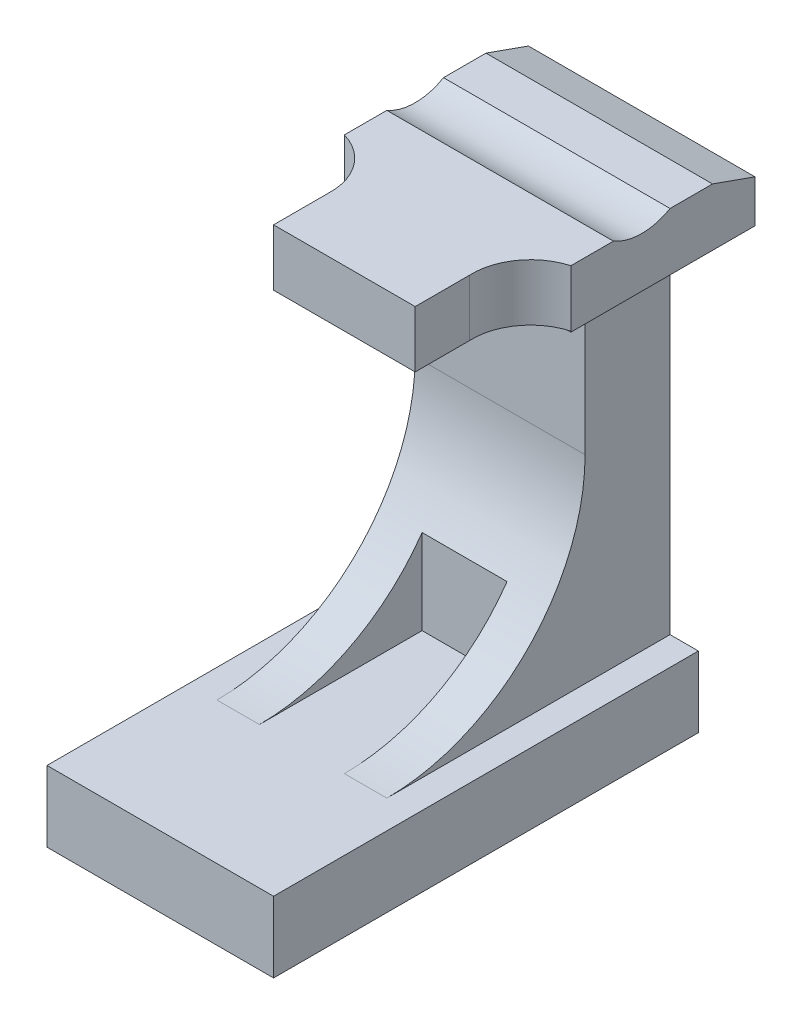
ISO-10303-21;
HEADER;
FILE_DESCRIPTION(('STEP AP214'),'2;1');
FILE_NAME('part.step','',(''),(''),'','','');
FILE_SCHEMA(('AUTOMOTIVE_DESIGN { 1 0 10303 214 1 1 1 1 }'));
ENDSEC;
DATA;
#1=APPLICATION_CONTEXT('core data for automotive mechanical design processes');
#2=APPLICATION_PROTOCOL_DEFINITION('international standard','automotive_design',2000,#1);
#3=PRODUCT_CONTEXT('',#1,'mechanical');
#4=PRODUCT('Part','Part','',(#3));
#5=PRODUCT_RELATED_PRODUCT_CATEGORY('part','',(#4));
#6=PRODUCT_DEFINITION_FORMATION('','',#4);
#7=PRODUCT_DEFINITION_CONTEXT('part definition',#1,'design');
#8=PRODUCT_DEFINITION('design','',#6,#7);
#9=PRODUCT_DEFINITION_SHAPE('','',#8);
#10=(LENGTH_UNIT() NAMED_UNIT(*) SI_UNIT(.MILLI.,.METRE.));
#11=(NAMED_UNIT(*) PLANE_ANGLE_UNIT() SI_UNIT($,.RADIAN.));
#12=(NAMED_UNIT(*) SI_UNIT($,.STERADIAN.) SOLID_ANGLE_UNIT());
#13=UNCERTAINTY_MEASURE_WITH_UNIT(LENGTH_MEASURE(1.E-05),#10,'distance_accuracy_value','');
#14=(GEOMETRIC_REPRESENTATION_CONTEXT(3) GLOBAL_UNCERTAINTY_ASSIGNED_CONTEXT((#13)) GLOBAL_UNIT_ASSIGNED_CONTEXT((#10,
#11,#12)) REPRESENTATION_CONTEXT('',''));
#15=CARTESIAN_POINT('',(0.,0.,0.));
#16=DIRECTION('',(0.,0.,1.));
#17=DIRECTION('',(1.,0.,0.));
#18=AXIS2_PLACEMENT_3D('',#15,#16,#17);
#19=CARTESIAN_POINT('',(-22.156862745098,145.,-105.));
#20=DIRECTION('',(0.,0.,1.));
#21=DIRECTION('',(1.,0.,0.));
#22=AXIS2_PLACEMENT_3D('',#19,#20,#21);
#23=PLANE('',#22);
#24=DIRECTION('',(0.,-1.,0.));
#25=VECTOR('',#24,1.);
#26=CARTESIAN_POINT('',(47.843137254902,145.,-105.));
#27=LINE('',#26,#25);
#28=CARTESIAN_POINT('',(47.843137254902,145.320204543823,-105.));
#29=VERTEX_POINT('',#28);
#30=CARTESIAN_POINT('',(47.843137254902,145.,-105.));
#31=VERTEX_POINT('',#30);
#32=EDGE_CURVE('E291',#29,#31,#27,.T.);
#33=ORIENTED_EDGE('',*,*,#32,.F.);
#34=DIRECTION('',(-1.,0.,0.));
#35=VECTOR('',#34,1.);
#36=CARTESIAN_POINT('',(-32.156862745098,145.320204543823,-105.));
#37=LINE('',#36,#35);
#38=CARTESIAN_POINT('',(-32.156862745098,145.320204543823,-105.));
#39=VERTEX_POINT('',#38);
#40=EDGE_CURVE('E213',#29,#39,#37,.T.);
#41=ORIENTED_EDGE('',*,*,#40,.T.);
#42=DIRECTION('',(0.,1.,0.));
#43=VECTOR('',#42,1.);
#44=CARTESIAN_POINT('',(-32.156862745098,165.320204543823,-105.));
#45=LINE('',#44,#43);
#46=CARTESIAN_POINT('',(-32.156862745098,145.,-105.));
#47=VERTEX_POINT('',#46);
#48=EDGE_CURVE('E253',#47,#39,#45,.T.);
#49=ORIENTED_EDGE('',*,*,#48,.F.);
#50=DIRECTION('',(1.,0.,0.));
#51=VECTOR('',#50,1.);
#52=CARTESIAN_POINT('',(-22.156862745098,145.,-105.));
#53=LINE('',#52,#51);
#54=EDGE_CURVE('E298',#47,#31,#53,.T.);
#55=ORIENTED_EDGE('',*,*,#54,.T.);
#56=EDGE_LOOP('',(#33,#41,#49,#55));
#57=FACE_BOUND('',#56,.T.);
#58=ADVANCED_FACE('F39',(#57),#23,.T.);
#59=CARTESIAN_POINT('',(-22.156862745098,0.,0.));
#60=DIRECTION('',(1.,0.,0.));
#61=DIRECTION('',(0.,1.,0.));
#62=AXIS2_PLACEMENT_3D('',#59,#60,#61);
#63=PLANE('',#62);
#64=DIRECTION('',(0.,0.,1.));
#65=VECTOR('',#64,1.);
#66=CARTESIAN_POINT('',(-22.156862745098,145.,-105.));
#67=LINE('',#66,#65);
#68=CARTESIAN_POINT('',(-22.156862745098,145.,-150.));
#69=VERTEX_POINT('',#68);
#70=CARTESIAN_POINT('',(-22.156862745098,145.,-120.));
#71=VERTEX_POINT('',#70);
#72=EDGE_CURVE('E247',#69,#71,#67,.T.);
#73=ORIENTED_EDGE('',*,*,#72,.F.);
#74=DIRECTION('',(0.,1.,0.));
#75=VECTOR('',#74,1.);
#76=CARTESIAN_POINT('',(-22.156862745098,0.,-150.));
#77=LINE('',#76,#75);
#78=CARTESIAN_POINT('',(-22.156862745098,25.,-150.));
#79=VERTEX_POINT('',#78);
#80=EDGE_CURVE('E341',#79,#69,#77,.T.);
#81=ORIENTED_EDGE('',*,*,#80,.F.);
#82=DIRECTION('',(0.,0.,1.));
#83=VECTOR('',#82,1.);
#84=CARTESIAN_POINT('',(-22.156862745098,25.,0.));
#85=LINE('',#84,#83);
#86=CARTESIAN_POINT('',(-22.156862745098,25.,-50.));
#87=VERTEX_POINT('',#86);
#88=EDGE_CURVE('E338',#79,#87,#85,.T.);
#89=ORIENTED_EDGE('',*,*,#88,.T.);
#90=CARTESIAN_POINT('',(-22.156862745098,95.,-50.));
#91=DIRECTION('',(1.,0.,0.));
#92=DIRECTION('',(0.,1.,0.));
#93=AXIS2_PLACEMENT_3D('',#90,#91,#92);
#94=CIRCLE('',#93,70.);
#95=CARTESIAN_POINT('',(-22.156862745098,95.,-120.));
#96=VERTEX_POINT('',#95);
#97=EDGE_CURVE('E335',#87,#96,#94,.T.);
#98=ORIENTED_EDGE('',*,*,#97,.T.);
#99=DIRECTION('',(0.,-1.,0.));
#100=VECTOR('',#99,1.);
#101=CARTESIAN_POINT('',(-22.156862745098,0.,-120.));
#102=LINE('',#101,#100);
#103=EDGE_CURVE('E332',#71,#96,#102,.T.);
#104=ORIENTED_EDGE('',*,*,#103,.F.);
#105=EDGE_LOOP('',(#73,#81,#89,#98,#104));
#106=FACE_BOUND('',#105,.T.);
#107=ADVANCED_FACE('F430',(#106),#63,.F.);
#108=CARTESIAN_POINT('',(37.843137254902,0.,0.));
#109=DIRECTION('',(1.,0.,0.));
#110=DIRECTION('',(0.,1.,0.));
#111=AXIS2_PLACEMENT_3D('',#108,#109,#110);
#112=PLANE('',#111);
#113=DIRECTION('',(0.,1.,0.));
#114=VECTOR('',#113,1.);
#115=CARTESIAN_POINT('',(37.843137254902,0.,-150.));
#116=LINE('',#115,#114);
#117=CARTESIAN_POINT('',(37.843137254902,25.,-150.));
#118=VERTEX_POINT('',#117);
#119=CARTESIAN_POINT('',(37.843137254902,145.,-150.));
#120=VERTEX_POINT('',#119);
#121=EDGE_CURVE('E336',#118,#120,#116,.T.);
#122=ORIENTED_EDGE('',*,*,#121,.T.);
#123=DIRECTION('',(0.,0.,-1.));
#124=VECTOR('',#123,1.);
#125=CARTESIAN_POINT('',(37.843137254902,145.,-170.));
#126=LINE('',#125,#124);
#127=CARTESIAN_POINT('',(37.843137254902,145.,-120.));
#128=VERTEX_POINT('',#127);
#129=EDGE_CURVE('E274',#128,#120,#126,.T.);
#130=ORIENTED_EDGE('',*,*,#129,.F.);
#131=DIRECTION('',(0.,-1.,0.));
#132=VECTOR('',#131,1.);
#133=CARTESIAN_POINT('',(37.843137254902,0.,-120.));
#134=LINE('',#133,#132);
#135=CARTESIAN_POINT('',(37.843137254902,95.,-120.));
#136=VERTEX_POINT('',#135);
#137=EDGE_CURVE('E330',#128,#136,#134,.T.);
#138=ORIENTED_EDGE('',*,*,#137,.T.);
#139=CARTESIAN_POINT('',(37.843137254902,95.,-50.));
#140=DIRECTION('',(1.,0.,0.));
#141=DIRECTION('',(0.,1.,0.));
#142=AXIS2_PLACEMENT_3D('',#139,#140,#141);
#143=CIRCLE('',#142,70.);
#144=CARTESIAN_POINT('',(37.843137254902,25.,-50.));
#145=VERTEX_POINT('',#144);
#146=EDGE_CURVE('E347',#145,#136,#143,.T.);
#147=ORIENTED_EDGE('',*,*,#146,.F.);
#148=DIRECTION('',(0.,0.,1.));
#149=VECTOR('',#148,1.);
#150=CARTESIAN_POINT('',(37.843137254902,25.,0.));
#151=LINE('',#150,#149);
#152=EDGE_CURVE('E350',#118,#145,#151,.T.);
#153=ORIENTED_EDGE('',*,*,#152,.F.);
#154=EDGE_LOOP('',(#122,#130,#138,#147,#153));
#155=FACE_BOUND('',#154,.T.);
#156=ADVANCED_FACE('F414',(#155),#112,.T.);
#157=CARTESIAN_POINT('',(-22.156862745098,95.,-50.));
#158=DIRECTION('',(1.,0.,0.));
#159=DIRECTION('',(0.,1.,0.));
#160=AXIS2_PLACEMENT_3D('',#157,#158,#159);
#161=CYLINDRICAL_SURFACE('',#160,70.);
#162=CARTESIAN_POINT('',(-7.15686274509801,95.,-50.));
#163=DIRECTION('',(1.,0.,0.));
#164=DIRECTION('',(0.,1.,0.));
#165=AXIS2_PLACEMENT_3D('',#162,#163,#164);
#166=CIRCLE('',#165,70.);
#167=CARTESIAN_POINT('',(-7.15686274509802,25.,-50.));
#168=VERTEX_POINT('',#167);
#169=CARTESIAN_POINT('',(-7.15686274509802,55.,-107.44562646538));
#170=VERTEX_POINT('',#169);
#171=EDGE_CURVE('E314',#168,#170,#166,.T.);
#172=ORIENTED_EDGE('',*,*,#171,.T.);
#173=DIRECTION('',(1.,0.,0.));
#174=VECTOR('',#173,1.);
#175=CARTESIAN_POINT('',(-7.15686274509802,55.,-107.44562646538));
#176=LINE('',#175,#174);
#177=CARTESIAN_POINT('',(22.843137254902,55.,-107.44562646538));
#178=VERTEX_POINT('',#177);
#179=EDGE_CURVE('E327',#170,#178,#176,.T.);
#180=ORIENTED_EDGE('',*,*,#179,.T.);
#181=CARTESIAN_POINT('',(22.843137254902,95.,-50.));
#182=DIRECTION('',(1.,0.,0.));
#183=DIRECTION('',(0.,1.,0.));
#184=AXIS2_PLACEMENT_3D('',#181,#182,#183);
#185=CIRCLE('',#184,70.);
#186=CARTESIAN_POINT('',(22.843137254902,25.,-50.));
#187=VERTEX_POINT('',#186);
#188=EDGE_CURVE('E303',#187,#178,#185,.T.);
#189=ORIENTED_EDGE('',*,*,#188,.F.);
#190=DIRECTION('',(1.,0.,0.));
#191=VECTOR('',#190,1.);
#192=CARTESIAN_POINT('',(-22.156862745098,25.,-50.));
#193=LINE('',#192,#191);
#194=EDGE_CURVE('E361',#187,#145,#193,.T.);
#195=ORIENTED_EDGE('',*,*,#194,.T.);
#196=ORIENTED_EDGE('',*,*,#146,.T.);
#197=DIRECTION('',(1.,0.,0.));
#198=VECTOR('',#197,1.);
#199=CARTESIAN_POINT('',(-22.156862745098,95.,-120.));
#200=LINE('',#199,#198);
#201=EDGE_CURVE('E362',#96,#136,#200,.T.);
#202=ORIENTED_EDGE('',*,*,#201,.F.);
#203=ORIENTED_EDGE('',*,*,#97,.F.);
#204=EDGE_CURVE('E358',#87,#168,#193,.T.);
#205=ORIENTED_EDGE('',*,*,#204,.T.);
#206=EDGE_LOOP('',(#172,#180,#189,#195,#196,#202,#203,#205));
#207=FACE_BOUND('',#206,.T.);
#208=ADVANCED_FACE('F419',(#207),#161,.F.);
#209=CARTESIAN_POINT('',(-32.156862745098,25.,-150.));
#210=DIRECTION('',(0.,1.,0.));
#211=DIRECTION('',(0.,0.,1.));
#212=AXIS2_PLACEMENT_3D('',#209,#210,#211);
#213=PLANE('',#212);
#214=ORIENTED_EDGE('',*,*,#204,.F.);
#215=ORIENTED_EDGE('',*,*,#88,.F.);
#216=DIRECTION('',(-1.,0.,0.));
#217=VECTOR('',#216,1.);
#218=CARTESIAN_POINT('',(-32.156862745098,25.,-150.));
#219=LINE('',#218,#217);
#220=CARTESIAN_POINT('',(-32.156862745098,25.,-150.));
#221=VERTEX_POINT('',#220);
#222=EDGE_CURVE('E372',#79,#221,#219,.T.);
#223=ORIENTED_EDGE('',*,*,#222,.T.);
#224=DIRECTION('',(0.,0.,1.));
#225=VECTOR('',#224,1.);
#226=CARTESIAN_POINT('',(-32.156862745098,25.,-150.));
#227=LINE('',#226,#225);
#228=CARTESIAN_POINT('',(-32.156862745098,25.,0.));
#229=VERTEX_POINT('',#228);
#230=EDGE_CURVE('E48',#221,#229,#227,.T.);
#231=ORIENTED_EDGE('',*,*,#230,.T.);
#232=DIRECTION('',(-1.,0.,0.));
#233=VECTOR('',#232,1.);
#234=CARTESIAN_POINT('',(-32.156862745098,25.,0.));
#235=LINE('',#234,#233);
#236=CARTESIAN_POINT('',(47.843137254902,25.,0.));
#237=VERTEX_POINT('',#236);
#238=EDGE_CURVE('E383',#237,#229,#235,.T.);
#239=ORIENTED_EDGE('',*,*,#238,.F.);
#240=DIRECTION('',(0.,0.,1.));
#241=VECTOR('',#240,1.);
#242=CARTESIAN_POINT('',(47.843137254902,25.,-150.));
#243=LINE('',#242,#241);
#244=CARTESIAN_POINT('',(47.843137254902,25.,-150.));
#245=VERTEX_POINT('',#244);
#246=EDGE_CURVE('E388',#245,#237,#243,.T.);
#247=ORIENTED_EDGE('',*,*,#246,.F.);
#248=EDGE_CURVE('E373',#245,#118,#219,.T.);
#249=ORIENTED_EDGE('',*,*,#248,.T.);
#250=ORIENTED_EDGE('',*,*,#152,.T.);
#251=ORIENTED_EDGE('',*,*,#194,.F.);
#252=DIRECTION('',(0.,0.,-1.));
#253=VECTOR('',#252,1.);
#254=CARTESIAN_POINT('',(22.843137254902,25.,0.));
#255=LINE('',#254,#253);
#256=CARTESIAN_POINT('',(22.843137254902,25.,-107.44562646538));
#257=VERTEX_POINT('',#256);
#258=EDGE_CURVE('E64',#187,#257,#255,.T.);
#259=ORIENTED_EDGE('',*,*,#258,.T.);
#260=DIRECTION('',(1.,0.,0.));
#261=VECTOR('',#260,1.);
#262=CARTESIAN_POINT('',(-7.15686274509802,25.,-107.44562646538));
#263=LINE('',#262,#261);
#264=CARTESIAN_POINT('',(-7.15686274509802,25.,-107.44562646538));
#265=VERTEX_POINT('',#264);
#266=EDGE_CURVE('E323',#265,#257,#263,.T.);
#267=ORIENTED_EDGE('',*,*,#266,.F.);
#268=DIRECTION('',(0.,0.,-1.));
#269=VECTOR('',#268,1.);
#270=CARTESIAN_POINT('',(-7.15686274509802,25.,0.));
#271=LINE('',#270,#269);
#272=EDGE_CURVE('E317',#168,#265,#271,.T.);
#273=ORIENTED_EDGE('',*,*,#272,.F.);
#274=EDGE_LOOP('',(#214,#215,#223,#231,#239,#247,#249,#250,#251,#259,#267,#273));
#275=FACE_BOUND('',#274,.T.);
#276=ADVANCED_FACE('F410',(#275),#213,.T.);
#277=CARTESIAN_POINT('',(47.843137254902,0.,-150.));
#278=DIRECTION('',(0.,-1.,0.));
#279=DIRECTION('',(0.,0.,-1.));
#280=AXIS2_PLACEMENT_3D('',#277,#278,#279);
#281=PLANE('',#280);
#282=DIRECTION('',(1.,0.,0.));
#283=VECTOR('',#282,1.);
#284=CARTESIAN_POINT('',(47.843137254902,0.,0.));
#285=LINE('',#284,#283);
#286=CARTESIAN_POINT('',(-32.156862745098,0.,0.));
#287=VERTEX_POINT('',#286);
#288=CARTESIAN_POINT('',(47.843137254902,0.,0.));
#289=VERTEX_POINT('',#288);
#290=EDGE_CURVE('E357',#287,#289,#285,.T.);
#291=ORIENTED_EDGE('',*,*,#290,.F.);
#292=DIRECTION('',(0.,0.,1.));
#293=VECTOR('',#292,1.);
#294=CARTESIAN_POINT('',(-32.156862745098,0.,-150.));
#295=LINE('',#294,#293);
#296=CARTESIAN_POINT('',(-32.156862745098,0.,-150.));
#297=VERTEX_POINT('',#296);
#298=EDGE_CURVE('E11',#297,#287,#295,.T.);
#299=ORIENTED_EDGE('',*,*,#298,.F.);
#300=DIRECTION('',(1.,0.,0.));
#301=VECTOR('',#300,1.);
#302=CARTESIAN_POINT('',(47.843137254902,0.,-150.));
#303=LINE('',#302,#301);
#304=CARTESIAN_POINT('',(47.843137254902,0.,-150.));
#305=VERTEX_POINT('',#304);
#306=EDGE_CURVE('E365',#297,#305,#303,.T.);
#307=ORIENTED_EDGE('',*,*,#306,.T.);
#308=DIRECTION('',(0.,0.,1.));
#309=VECTOR('',#308,1.);
#310=CARTESIAN_POINT('',(47.843137254902,0.,-150.));
#311=LINE('',#310,#309);
#312=EDGE_CURVE('E43',#305,#289,#311,.T.);
#313=ORIENTED_EDGE('',*,*,#312,.T.);
#314=EDGE_LOOP('',(#291,#299,#307,#313));
#315=FACE_BOUND('',#314,.T.);
#316=ADVANCED_FACE('F41',(#315),#281,.T.);
#317=CARTESIAN_POINT('',(-32.156862745098,0.,-150.));
#318=DIRECTION('',(-1.,0.,0.));
#319=DIRECTION('',(0.,-1.,0.));
#320=AXIS2_PLACEMENT_3D('',#317,#318,#319);
#321=PLANE('',#320);
#322=DIRECTION('',(0.,-1.,0.));
#323=VECTOR('',#322,1.);
#324=CARTESIAN_POINT('',(-32.156862745098,0.,0.));
#325=LINE('',#324,#323);
#326=EDGE_CURVE('E369',#229,#287,#325,.T.);
#327=ORIENTED_EDGE('',*,*,#326,.F.);
#328=ORIENTED_EDGE('',*,*,#230,.F.);
#329=DIRECTION('',(0.,-1.,0.));
#330=VECTOR('',#329,1.);
#331=CARTESIAN_POINT('',(-32.156862745098,0.,-150.));
#332=LINE('',#331,#330);
#333=EDGE_CURVE('E375',#221,#297,#332,.T.);
#334=ORIENTED_EDGE('',*,*,#333,.T.);
#335=ORIENTED_EDGE('',*,*,#298,.T.);
#336=EDGE_LOOP('',(#327,#328,#334,#335));
#337=FACE_BOUND('',#336,.T.);
#338=ADVANCED_FACE('F402',(#337),#321,.T.);
#339=CARTESIAN_POINT('',(47.843137254902,25.,-150.));
#340=DIRECTION('',(1.,0.,0.));
#341=DIRECTION('',(0.,1.,0.));
#342=AXIS2_PLACEMENT_3D('',#339,#340,#341);
#343=PLANE('',#342);
#344=DIRECTION('',(0.,1.,0.));
#345=VECTOR('',#344,1.);
#346=CARTESIAN_POINT('',(47.843137254902,25.,0.));
#347=LINE('',#346,#345);
#348=EDGE_CURVE('E380',#289,#237,#347,.T.);
#349=ORIENTED_EDGE('',*,*,#348,.F.);
#350=ORIENTED_EDGE('',*,*,#312,.F.);
#351=DIRECTION('',(0.,1.,0.));
#352=VECTOR('',#351,1.);
#353=CARTESIAN_POINT('',(47.843137254902,25.,-150.));
#354=LINE('',#353,#352);
#355=EDGE_CURVE('E368',#305,#245,#354,.T.);
#356=ORIENTED_EDGE('',*,*,#355,.T.);
#357=ORIENTED_EDGE('',*,*,#246,.T.);
#358=EDGE_LOOP('',(#349,#350,#356,#357));
#359=FACE_BOUND('',#358,.T.);
#360=ADVANCED_FACE('F396',(#359),#343,.T.);
#361=CARTESIAN_POINT('',(0.,0.,-150.));
#362=DIRECTION('',(0.,0.,-1.));
#363=DIRECTION('',(-1.,0.,0.));
#364=AXIS2_PLACEMENT_3D('',#361,#362,#363);
#365=PLANE('',#364);
#366=ORIENTED_EDGE('',*,*,#306,.F.);
#367=ORIENTED_EDGE('',*,*,#333,.F.);
#368=ORIENTED_EDGE('',*,*,#222,.F.);
#369=ORIENTED_EDGE('',*,*,#80,.T.);
#370=DIRECTION('',(1.,0.,0.));
#371=VECTOR('',#370,1.);
#372=CARTESIAN_POINT('',(-22.156862745098,145.,-150.));
#373=LINE('',#372,#371);
#374=EDGE_CURVE('E355',#69,#120,#373,.T.);
#375=ORIENTED_EDGE('',*,*,#374,.T.);
#376=ORIENTED_EDGE('',*,*,#121,.F.);
#377=ORIENTED_EDGE('',*,*,#248,.F.);
#378=ORIENTED_EDGE('',*,*,#355,.F.);
#379=EDGE_LOOP('',(#366,#367,#368,#369,#375,#376,#377,#378));
#380=FACE_BOUND('',#379,.T.);
#381=ADVANCED_FACE('F405',(#380),#365,.T.);
#382=CARTESIAN_POINT('',(0.,0.,0.));
#383=DIRECTION('',(0.,0.,-1.));
#384=DIRECTION('',(-1.,0.,0.));
#385=AXIS2_PLACEMENT_3D('',#382,#383,#384);
#386=PLANE('',#385);
#387=ORIENTED_EDGE('',*,*,#290,.T.);
#388=ORIENTED_EDGE('',*,*,#348,.T.);
#389=ORIENTED_EDGE('',*,*,#238,.T.);
#390=ORIENTED_EDGE('',*,*,#326,.T.);
#391=EDGE_LOOP('',(#387,#388,#389,#390));
#392=FACE_BOUND('',#391,.T.);
#393=ADVANCED_FACE('F398',(#392),#386,.F.);
#394=CARTESIAN_POINT('',(-22.156862745098,0.,-120.));
#395=DIRECTION('',(0.,0.,1.));
#396=DIRECTION('',(1.,0.,0.));
#397=AXIS2_PLACEMENT_3D('',#394,#395,#396);
#398=PLANE('',#397);
#399=ORIENTED_EDGE('',*,*,#137,.F.);
#400=DIRECTION('',(1.,0.,0.));
#401=VECTOR('',#400,1.);
#402=CARTESIAN_POINT('',(-22.156862745098,145.,-120.));
#403=LINE('',#402,#401);
#404=EDGE_CURVE('E344',#71,#128,#403,.T.);
#405=ORIENTED_EDGE('',*,*,#404,.F.);
#406=ORIENTED_EDGE('',*,*,#103,.T.);
#407=ORIENTED_EDGE('',*,*,#201,.T.);
#408=EDGE_LOOP('',(#399,#405,#406,#407));
#409=FACE_BOUND('',#408,.T.);
#410=ADVANCED_FACE('F438',(#409),#398,.T.);
#411=CARTESIAN_POINT('',(-7.15686274509803,0.,-107.44562646538));
#412=DIRECTION('',(0.,0.,1.));
#413=DIRECTION('',(1.,0.,0.));
#414=AXIS2_PLACEMENT_3D('',#411,#412,#413);
#415=PLANE('',#414);
#416=DIRECTION('',(0.,-1.,0.));
#417=VECTOR('',#416,1.);
#418=CARTESIAN_POINT('',(22.843137254902,0.,-107.44562646538));
#419=LINE('',#418,#417);
#420=EDGE_CURVE('E318',#178,#257,#419,.T.);
#421=ORIENTED_EDGE('',*,*,#420,.F.);
#422=ORIENTED_EDGE('',*,*,#179,.F.);
#423=DIRECTION('',(0.,-1.,0.));
#424=VECTOR('',#423,1.);
#425=CARTESIAN_POINT('',(-7.15686274509803,0.,-107.44562646538));
#426=LINE('',#425,#424);
#427=EDGE_CURVE('E321',#170,#265,#426,.T.);
#428=ORIENTED_EDGE('',*,*,#427,.T.);
#429=ORIENTED_EDGE('',*,*,#266,.T.);
#430=EDGE_LOOP('',(#421,#422,#428,#429));
#431=FACE_BOUND('',#430,.T.);
#432=ADVANCED_FACE('F440',(#431),#415,.T.);
#433=CARTESIAN_POINT('',(-7.15686274509803,0.,0.));
#434=DIRECTION('',(1.,0.,0.));
#435=DIRECTION('',(0.,1.,0.));
#436=AXIS2_PLACEMENT_3D('',#433,#434,#435);
#437=PLANE('',#436);
#438=ORIENTED_EDGE('',*,*,#171,.F.);
#439=ORIENTED_EDGE('',*,*,#272,.T.);
#440=ORIENTED_EDGE('',*,*,#427,.F.);
#441=EDGE_LOOP('',(#438,#439,#440));
#442=FACE_BOUND('',#441,.T.);
#443=ADVANCED_FACE('F425',(#442),#437,.T.);
#444=CARTESIAN_POINT('',(22.843137254902,0.,0.));
#445=DIRECTION('',(1.,0.,0.));
#446=DIRECTION('',(0.,1.,0.));
#447=AXIS2_PLACEMENT_3D('',#444,#445,#446);
#448=PLANE('',#447);
#449=ORIENTED_EDGE('',*,*,#188,.T.);
#450=ORIENTED_EDGE('',*,*,#420,.T.);
#451=ORIENTED_EDGE('',*,*,#258,.F.);
#452=EDGE_LOOP('',(#449,#450,#451));
#453=FACE_BOUND('',#452,.T.);
#454=ADVANCED_FACE('F463',(#453),#448,.F.);
#455=CARTESIAN_POINT('',(-22.156862745098,145.,-105.));
#456=DIRECTION('',(0.,-1.,0.));
#457=DIRECTION('',(1.,0.,0.));
#458=AXIS2_PLACEMENT_3D('',#455,#456,#457);
#459=PLANE('',#458);
#460=ORIENTED_EDGE('',*,*,#72,.T.);
#461=ORIENTED_EDGE('',*,*,#404,.T.);
#462=ORIENTED_EDGE('',*,*,#129,.T.);
#463=ORIENTED_EDGE('',*,*,#374,.F.);
#464=EDGE_LOOP('',(#460,#461,#462,#463));
#465=FACE_BOUND('',#464,.T.);
#466=ORIENTED_EDGE('',*,*,#54,.F.);
#467=DIRECTION('',(0.,0.,1.));
#468=VECTOR('',#467,1.);
#469=CARTESIAN_POINT('',(-32.156862745098,145.,-105.));
#470=LINE('',#469,#468);
#471=CARTESIAN_POINT('',(-32.156862745098,145.,-170.));
#472=VERTEX_POINT('',#471);
#473=EDGE_CURVE('E271',#472,#47,#470,.T.);
#474=ORIENTED_EDGE('',*,*,#473,.F.);
#475=DIRECTION('',(1.,0.,0.));
#476=VECTOR('',#475,1.);
#477=CARTESIAN_POINT('',(-22.156862745098,145.,-170.));
#478=LINE('',#477,#476);
#479=CARTESIAN_POINT('',(47.843137254902,145.,-170.));
#480=VERTEX_POINT('',#479);
#481=EDGE_CURVE('E310',#472,#480,#478,.T.);
#482=ORIENTED_EDGE('',*,*,#481,.T.);
#483=DIRECTION('',(0.,0.,-1.));
#484=VECTOR('',#483,1.);
#485=CARTESIAN_POINT('',(47.843137254902,145.,-170.));
#486=LINE('',#485,#484);
#487=EDGE_CURVE('E295',#31,#480,#486,.T.);
#488=ORIENTED_EDGE('',*,*,#487,.F.);
#489=EDGE_LOOP('',(#466,#474,#482,#488));
#490=FACE_BOUND('',#489,.T.);
#491=ADVANCED_FACE('F434',(#465,#490),#459,.T.);
#492=CARTESIAN_POINT('',(-22.156862745098,165.320204543823,-105.));
#493=DIRECTION('',(0.,1.,0.));
#494=DIRECTION('',(-1.,0.,0.));
#495=AXIS2_PLACEMENT_3D('',#492,#493,#494);
#496=PLANE('',#495);
#497=DIRECTION('',(0.,0.,-1.));
#498=VECTOR('',#497,1.);
#499=CARTESIAN_POINT('',(-32.156862745098,165.320204543823,-120.));
#500=LINE('',#499,#498);
#501=CARTESIAN_POINT('',(-32.156862745098,165.320204543823,-105.));
#502=VERTEX_POINT('',#501);
#503=CARTESIAN_POINT('',(-32.156862745098,165.320204543823,-120.));
#504=VERTEX_POINT('',#503);
#505=EDGE_CURVE('E256',#502,#504,#500,.T.);
#506=ORIENTED_EDGE('',*,*,#505,.F.);
#507=CARTESIAN_POINT('',(-37.8598046564262,165.320204543823,-85.0864495934507));
#508=DIRECTION('',(0.,-1.,0.));
#509=DIRECTION('',(1.,0.,0.));
#510=AXIS2_PLACEMENT_3D('',#507,#508,#509);
#511=CIRCLE('',#510,20.7140782135764);
#512=CARTESIAN_POINT('',(-17.156862745098,165.320204543823,-84.4073086255122));
#513=VERTEX_POINT('',#512);
#514=EDGE_CURVE('E238',#502,#513,#511,.T.);
#515=ORIENTED_EDGE('',*,*,#514,.T.);
#516=DIRECTION('',(0.,0.,1.));
#517=VECTOR('',#516,1.);
#518=CARTESIAN_POINT('',(-17.156862745098,165.320204543823,-84.4073086255122));
#519=LINE('',#518,#517);
#520=CARTESIAN_POINT('',(-17.156862745098,165.320204543823,-65.));
#521=VERTEX_POINT('',#520);
#522=EDGE_CURVE('E209',#513,#521,#519,.T.);
#523=ORIENTED_EDGE('',*,*,#522,.T.);
#524=DIRECTION('',(1.,0.,0.));
#525=VECTOR('',#524,1.);
#526=CARTESIAN_POINT('',(-17.156862745098,165.320204543823,-65.));
#527=LINE('',#526,#525);
#528=CARTESIAN_POINT('',(32.843137254902,165.320204543823,-65.));
#529=VERTEX_POINT('',#528);
#530=EDGE_CURVE('E241',#521,#529,#527,.T.);
#531=ORIENTED_EDGE('',*,*,#530,.T.);
#532=DIRECTION('',(0.,0.,-1.));
#533=VECTOR('',#532,1.);
#534=CARTESIAN_POINT('',(32.843137254902,165.320204543823,-84.1345301239189));
#535=LINE('',#534,#533);
#536=CARTESIAN_POINT('',(32.843137254902,165.320204543823,-84.1345301239189));
#537=VERTEX_POINT('',#536);
#538=EDGE_CURVE('E228',#529,#537,#535,.T.);
#539=ORIENTED_EDGE('',*,*,#538,.T.);
#540=CARTESIAN_POINT('',(53.5312485588255,165.320204543823,-85.0864495934507));
#541=DIRECTION('',(0.,-1.,0.));
#542=DIRECTION('',(-1.,0.,0.));
#543=AXIS2_PLACEMENT_3D('',#540,#541,#542);
#544=CIRCLE('',#543,20.71);
#545=CARTESIAN_POINT('',(47.843137254902,165.320204543823,-105.));
#546=VERTEX_POINT('',#545);
#547=EDGE_CURVE('E225',#537,#546,#544,.T.);
#548=ORIENTED_EDGE('',*,*,#547,.T.);
#549=DIRECTION('',(0.,0.,1.));
#550=VECTOR('',#549,1.);
#551=CARTESIAN_POINT('',(47.843137254902,165.320204543823,-105.));
#552=LINE('',#551,#550);
#553=CARTESIAN_POINT('',(47.843137254902,165.320204543823,-120.));
#554=VERTEX_POINT('',#553);
#555=EDGE_CURVE('E288',#554,#546,#552,.T.);
#556=ORIENTED_EDGE('',*,*,#555,.F.);
#557=DIRECTION('',(1.,0.,0.));
#558=VECTOR('',#557,1.);
#559=CARTESIAN_POINT('',(-22.156862745098,165.320204543823,-120.));
#560=LINE('',#559,#558);
#561=EDGE_CURVE('E301',#504,#554,#560,.T.);
#562=ORIENTED_EDGE('',*,*,#561,.F.);
#563=EDGE_LOOP('',(#506,#515,#523,#531,#539,#548,#556,#562));
#564=FACE_BOUND('',#563,.T.);
#565=ADVANCED_FACE('F561',(#564),#496,.T.);
#566=CARTESIAN_POINT('',(-22.156862745098,182.640712619512,-130.));
#567=DIRECTION('',(1.,0.,0.));
#568=DIRECTION('',(0.,1.,0.));
#569=AXIS2_PLACEMENT_3D('',#566,#567,#568);
#570=CYLINDRICAL_SURFACE('',#569,20.);
#571=ORIENTED_EDGE('',*,*,#561,.T.);
#572=CARTESIAN_POINT('',(47.843137254902,182.640712619512,-130.));
#573=DIRECTION('',(-1.,0.,0.));
#574=DIRECTION('',(0.,1.,0.));
#575=AXIS2_PLACEMENT_3D('',#572,#573,#574);
#576=CIRCLE('',#575,20.0000000000002);
#577=CARTESIAN_POINT('',(47.843137254902,165.320204543823,-140.));
#578=VERTEX_POINT('',#577);
#579=EDGE_CURVE('E285',#578,#554,#576,.T.);
#580=ORIENTED_EDGE('',*,*,#579,.F.);
#581=DIRECTION('',(1.,0.,0.));
#582=VECTOR('',#581,1.);
#583=CARTESIAN_POINT('',(-22.156862745098,165.320204543823,-140.));
#584=LINE('',#583,#582);
#585=CARTESIAN_POINT('',(-32.156862745098,165.320204543823,-140.));
#586=VERTEX_POINT('',#585);
#587=EDGE_CURVE('E304',#586,#578,#584,.T.);
#588=ORIENTED_EDGE('',*,*,#587,.F.);
#589=CARTESIAN_POINT('',(-32.156862745098,182.640712619511,-130.));
#590=DIRECTION('',(1.,0.,0.));
#591=DIRECTION('',(0.,-1.,0.));
#592=AXIS2_PLACEMENT_3D('',#589,#590,#591);
#593=CIRCLE('',#592,19.9999999999997);
#594=EDGE_CURVE('E259',#504,#586,#593,.T.);
#595=ORIENTED_EDGE('',*,*,#594,.F.);
#596=EDGE_LOOP('',(#571,#580,#588,#595));
#597=FACE_BOUND('',#596,.T.);
#598=ADVANCED_FACE('F569',(#597),#570,.F.);
#599=CARTESIAN_POINT('',(-22.156862745098,165.320204543823,-155.));
#600=DIRECTION('',(0.,1.,0.));
#601=DIRECTION('',(-1.,0.,0.));
#602=AXIS2_PLACEMENT_3D('',#599,#600,#601);
#603=PLANE('',#602);
#604=ORIENTED_EDGE('',*,*,#587,.T.);
#605=DIRECTION('',(0.,0.,1.));
#606=VECTOR('',#605,1.);
#607=CARTESIAN_POINT('',(47.843137254902,165.320204543823,-140.));
#608=LINE('',#607,#606);
#609=CARTESIAN_POINT('',(47.843137254902,165.320204543823,-155.));
#610=VERTEX_POINT('',#609);
#611=EDGE_CURVE('E282',#610,#578,#608,.T.);
#612=ORIENTED_EDGE('',*,*,#611,.F.);
#613=DIRECTION('',(1.,0.,0.));
#614=VECTOR('',#613,1.);
#615=CARTESIAN_POINT('',(-22.156862745098,165.320204543823,-155.));
#616=LINE('',#615,#614);
#617=CARTESIAN_POINT('',(-32.156862745098,165.320204543823,-155.));
#618=VERTEX_POINT('',#617);
#619=EDGE_CURVE('E306',#618,#610,#616,.T.);
#620=ORIENTED_EDGE('',*,*,#619,.F.);
#621=DIRECTION('',(0.,0.,-1.));
#622=VECTOR('',#621,1.);
#623=CARTESIAN_POINT('',(-32.156862745098,165.320204543823,-155.));
#624=LINE('',#623,#622);
#625=EDGE_CURVE('E262',#586,#618,#624,.T.);
#626=ORIENTED_EDGE('',*,*,#625,.F.);
#627=EDGE_LOOP('',(#604,#612,#620,#626));
#628=FACE_BOUND('',#627,.T.);
#629=ADVANCED_FACE('F579',(#628),#603,.T.);
#630=CARTESIAN_POINT('',(-22.156862745098,160.,-170.));
#631=DIRECTION('',(0.,0.942474787337253,-0.334277243068683));
#632=DIRECTION('',(0.,0.334277243068683,0.942474787337253));
#633=AXIS2_PLACEMENT_3D('',#630,#631,#632);
#634=PLANE('',#633);
#635=ORIENTED_EDGE('',*,*,#619,.T.);
#636=DIRECTION('',(0.,0.334277243068683,0.942474787337253));
#637=VECTOR('',#636,1.);
#638=CARTESIAN_POINT('',(47.843137254902,165.320204543823,-155.));
#639=LINE('',#638,#637);
#640=CARTESIAN_POINT('',(47.843137254902,160.,-170.));
#641=VERTEX_POINT('',#640);
#642=EDGE_CURVE('E279',#641,#610,#639,.T.);
#643=ORIENTED_EDGE('',*,*,#642,.F.);
#644=DIRECTION('',(1.,0.,0.));
#645=VECTOR('',#644,1.);
#646=CARTESIAN_POINT('',(-22.156862745098,160.,-170.));
#647=LINE('',#646,#645);
#648=CARTESIAN_POINT('',(-32.156862745098,160.,-170.));
#649=VERTEX_POINT('',#648);
#650=EDGE_CURVE('E308',#649,#641,#647,.T.);
#651=ORIENTED_EDGE('',*,*,#650,.F.);
#652=DIRECTION('',(0.,-0.334277243068683,-0.942474787337253));
#653=VECTOR('',#652,1.);
#654=CARTESIAN_POINT('',(-32.156862745098,160.,-170.));
#655=LINE('',#654,#653);
#656=EDGE_CURVE('E265',#618,#649,#655,.T.);
#657=ORIENTED_EDGE('',*,*,#656,.F.);
#658=EDGE_LOOP('',(#635,#643,#651,#657));
#659=FACE_BOUND('',#658,.T.);
#660=ADVANCED_FACE('F589',(#659),#634,.T.);
#661=CARTESIAN_POINT('',(-22.156862745098,145.,-170.));
#662=DIRECTION('',(0.,0.,-1.));
#663=DIRECTION('',(-1.,0.,0.));
#664=AXIS2_PLACEMENT_3D('',#661,#662,#663);
#665=PLANE('',#664);
#666=ORIENTED_EDGE('',*,*,#650,.T.);
#667=DIRECTION('',(0.,1.,0.));
#668=VECTOR('',#667,1.);
#669=CARTESIAN_POINT('',(47.843137254902,160.,-170.));
#670=LINE('',#669,#668);
#671=EDGE_CURVE('E276',#480,#641,#670,.T.);
#672=ORIENTED_EDGE('',*,*,#671,.F.);
#673=ORIENTED_EDGE('',*,*,#481,.F.);
#674=DIRECTION('',(0.,-1.,0.));
#675=VECTOR('',#674,1.);
#676=CARTESIAN_POINT('',(-32.156862745098,145.,-170.));
#677=LINE('',#676,#675);
#678=EDGE_CURVE('E268',#649,#472,#677,.T.);
#679=ORIENTED_EDGE('',*,*,#678,.F.);
#680=EDGE_LOOP('',(#666,#672,#673,#679));
#681=FACE_BOUND('',#680,.T.);
#682=ADVANCED_FACE('F599',(#681),#665,.T.);
#683=CARTESIAN_POINT('',(47.843137254902,182.640712619512,-130.));
#684=DIRECTION('',(1.,0.,0.));
#685=DIRECTION('',(0.,1.,0.));
#686=AXIS2_PLACEMENT_3D('',#683,#684,#685);
#687=PLANE('',#686);
#688=ORIENTED_EDGE('',*,*,#671,.T.);
#689=ORIENTED_EDGE('',*,*,#642,.T.);
#690=ORIENTED_EDGE('',*,*,#611,.T.);
#691=ORIENTED_EDGE('',*,*,#579,.T.);
#692=ORIENTED_EDGE('',*,*,#555,.T.);
#693=EDGE_CURVE('E292',#546,#29,#27,.T.);
#694=ORIENTED_EDGE('',*,*,#693,.T.);
#695=ORIENTED_EDGE('',*,*,#32,.T.);
#696=ORIENTED_EDGE('',*,*,#487,.T.);
#697=EDGE_LOOP('',(#688,#689,#690,#691,#692,#694,#695,#696));
#698=FACE_BOUND('',#697,.T.);
#699=ADVANCED_FACE('F609',(#698),#687,.T.);
#700=CARTESIAN_POINT('',(-32.156862745098,182.640712619511,-130.));
#701=DIRECTION('',(-1.,0.,0.));
#702=DIRECTION('',(0.,-1.,0.));
#703=AXIS2_PLACEMENT_3D('',#700,#701,#702);
#704=PLANE('',#703);
#705=ORIENTED_EDGE('',*,*,#48,.T.);
#706=DIRECTION('',(0.,1.,0.));
#707=VECTOR('',#706,1.);
#708=CARTESIAN_POINT('',(-32.156862745098,145.320204543823,-105.));
#709=LINE('',#708,#707);
#710=EDGE_CURVE('E223',#39,#502,#709,.T.);
#711=ORIENTED_EDGE('',*,*,#710,.T.);
#712=ORIENTED_EDGE('',*,*,#505,.T.);
#713=ORIENTED_EDGE('',*,*,#594,.T.);
#714=ORIENTED_EDGE('',*,*,#625,.T.);
#715=ORIENTED_EDGE('',*,*,#656,.T.);
#716=ORIENTED_EDGE('',*,*,#678,.T.);
#717=ORIENTED_EDGE('',*,*,#473,.T.);
#718=EDGE_LOOP('',(#705,#711,#712,#713,#714,#715,#716,#717));
#719=FACE_BOUND('',#718,.T.);
#720=ADVANCED_FACE('F628',(#719),#704,.T.);
#721=CARTESIAN_POINT('',(-37.8598046564262,145.320204543823,-85.0864495934507));
#722=DIRECTION('',(0.,1.,0.));
#723=DIRECTION('',(-1.,0.,0.));
#724=AXIS2_PLACEMENT_3D('',#721,#722,#723);
#725=CYLINDRICAL_SURFACE('',#724,20.7140782135764);
#726=ORIENTED_EDGE('',*,*,#514,.F.);
#727=ORIENTED_EDGE('',*,*,#710,.F.);
#728=CARTESIAN_POINT('',(-37.8598046564262,145.320204543823,-85.0864495934507));
#729=DIRECTION('',(0.,-1.,0.));
#730=DIRECTION('',(1.,0.,0.));
#731=AXIS2_PLACEMENT_3D('',#728,#729,#730);
#732=CIRCLE('',#731,20.7140782135764);
#733=CARTESIAN_POINT('',(-17.156862745098,145.320204543823,-84.4073086255122));
#734=VERTEX_POINT('',#733);
#735=EDGE_CURVE('E56',#39,#734,#732,.T.);
#736=ORIENTED_EDGE('',*,*,#735,.T.);
#737=DIRECTION('',(0.,1.,0.));
#738=VECTOR('',#737,1.);
#739=CARTESIAN_POINT('',(-17.156862745098,145.320204543823,-84.4073086255122));
#740=LINE('',#739,#738);
#741=EDGE_CURVE('E205',#734,#513,#740,.T.);
#742=ORIENTED_EDGE('',*,*,#741,.T.);
#743=EDGE_LOOP('',(#726,#727,#736,#742));
#744=FACE_BOUND('',#743,.T.);
#745=ADVANCED_FACE('F221',(#744),#725,.F.);
#746=CARTESIAN_POINT('',(53.5312485588255,145.320204543823,-85.0864495934507));
#747=DIRECTION('',(0.,1.,0.));
#748=DIRECTION('',(-1.,0.,0.));
#749=AXIS2_PLACEMENT_3D('',#746,#747,#748);
#750=CYLINDRICAL_SURFACE('',#749,20.71);
#751=ORIENTED_EDGE('',*,*,#547,.F.);
#752=DIRECTION('',(0.,1.,0.));
#753=VECTOR('',#752,1.);
#754=CARTESIAN_POINT('',(32.843137254902,145.320204543823,-84.1345301239189));
#755=LINE('',#754,#753);
#756=CARTESIAN_POINT('',(32.843137254902,145.320204543823,-84.1345301239189));
#757=VERTEX_POINT('',#756);
#758=EDGE_CURVE('E248',#757,#537,#755,.T.);
#759=ORIENTED_EDGE('',*,*,#758,.F.);
#760=CARTESIAN_POINT('',(53.5312485588255,145.320204543823,-85.0864495934507));
#761=DIRECTION('',(0.,-1.,0.));
#762=DIRECTION('',(-1.,0.,0.));
#763=AXIS2_PLACEMENT_3D('',#760,#761,#762);
#764=CIRCLE('',#763,20.71);
#765=EDGE_CURVE('E235',#757,#29,#764,.T.);
#766=ORIENTED_EDGE('',*,*,#765,.T.);
#767=ORIENTED_EDGE('',*,*,#693,.F.);
#768=EDGE_LOOP('',(#751,#759,#766,#767));
#769=FACE_BOUND('',#768,.T.);
#770=ADVANCED_FACE('F668',(#769),#750,.F.);
#771=CARTESIAN_POINT('',(32.843137254902,145.320204543823,-84.1345301239189));
#772=DIRECTION('',(1.,0.,0.));
#773=DIRECTION('',(0.,1.,0.));
#774=AXIS2_PLACEMENT_3D('',#771,#772,#773);
#775=PLANE('',#774);
#776=ORIENTED_EDGE('',*,*,#538,.F.);
#777=DIRECTION('',(0.,1.,0.));
#778=VECTOR('',#777,1.);
#779=CARTESIAN_POINT('',(32.843137254902,145.320204543823,-65.));
#780=LINE('',#779,#778);
#781=CARTESIAN_POINT('',(32.843137254902,145.320204543823,-65.));
#782=VERTEX_POINT('',#781);
#783=EDGE_CURVE('E250',#782,#529,#780,.T.);
#784=ORIENTED_EDGE('',*,*,#783,.F.);
#785=DIRECTION('',(0.,0.,-1.));
#786=VECTOR('',#785,1.);
#787=CARTESIAN_POINT('',(32.843137254902,145.320204543823,-84.1345301239189));
#788=LINE('',#787,#786);
#789=EDGE_CURVE('E232',#782,#757,#788,.T.);
#790=ORIENTED_EDGE('',*,*,#789,.T.);
#791=ORIENTED_EDGE('',*,*,#758,.T.);
#792=EDGE_LOOP('',(#776,#784,#790,#791));
#793=FACE_BOUND('',#792,.T.);
#794=ADVANCED_FACE('F677',(#793),#775,.T.);
#795=CARTESIAN_POINT('',(-17.156862745098,145.320204543823,-65.));
#796=DIRECTION('',(0.,0.,1.));
#797=DIRECTION('',(1.,0.,0.));
#798=AXIS2_PLACEMENT_3D('',#795,#796,#797);
#799=PLANE('',#798);
#800=ORIENTED_EDGE('',*,*,#530,.F.);
#801=DIRECTION('',(0.,1.,0.));
#802=VECTOR('',#801,1.);
#803=CARTESIAN_POINT('',(-17.156862745098,145.320204543823,-65.));
#804=LINE('',#803,#802);
#805=CARTESIAN_POINT('',(-17.156862745098,145.320204543823,-65.));
#806=VERTEX_POINT('',#805);
#807=EDGE_CURVE('E212',#806,#521,#804,.T.);
#808=ORIENTED_EDGE('',*,*,#807,.F.);
#809=DIRECTION('',(1.,0.,0.));
#810=VECTOR('',#809,1.);
#811=CARTESIAN_POINT('',(-17.156862745098,145.320204543823,-65.));
#812=LINE('',#811,#810);
#813=EDGE_CURVE('E219',#806,#782,#812,.T.);
#814=ORIENTED_EDGE('',*,*,#813,.T.);
#815=ORIENTED_EDGE('',*,*,#783,.T.);
#816=EDGE_LOOP('',(#800,#808,#814,#815));
#817=FACE_BOUND('',#816,.T.);
#818=ADVANCED_FACE('F687',(#817),#799,.T.);
#819=CARTESIAN_POINT('',(-17.156862745098,145.320204543823,-84.4073086255122));
#820=DIRECTION('',(-1.,0.,0.));
#821=DIRECTION('',(0.,-1.,0.));
#822=AXIS2_PLACEMENT_3D('',#819,#820,#821);
#823=PLANE('',#822);
#824=ORIENTED_EDGE('',*,*,#522,.F.);
#825=ORIENTED_EDGE('',*,*,#741,.F.);
#826=DIRECTION('',(0.,0.,1.));
#827=VECTOR('',#826,1.);
#828=CARTESIAN_POINT('',(-17.156862745098,145.320204543823,-84.4073086255122));
#829=LINE('',#828,#827);
#830=EDGE_CURVE('E207',#734,#806,#829,.T.);
#831=ORIENTED_EDGE('',*,*,#830,.T.);
#832=ORIENTED_EDGE('',*,*,#807,.T.);
#833=EDGE_LOOP('',(#824,#825,#831,#832));
#834=FACE_BOUND('',#833,.T.);
#835=ADVANCED_FACE('F206',(#834),#823,.T.);
#836=CARTESIAN_POINT('',(-37.8598046564262,145.320204543823,-85.0864495934507));
#837=DIRECTION('',(0.,-1.,0.));
#838=DIRECTION('',(1.,0.,0.));
#839=AXIS2_PLACEMENT_3D('',#836,#837,#838);
#840=PLANE('',#839);
#841=ORIENTED_EDGE('',*,*,#735,.F.);
#842=ORIENTED_EDGE('',*,*,#40,.F.);
#843=ORIENTED_EDGE('',*,*,#765,.F.);
#844=ORIENTED_EDGE('',*,*,#789,.F.);
#845=ORIENTED_EDGE('',*,*,#813,.F.);
#846=ORIENTED_EDGE('',*,*,#830,.F.);
#847=EDGE_LOOP('',(#841,#842,#843,#844,#845,#846));
#848=FACE_BOUND('',#847,.T.);
#849=ADVANCED_FACE('F216',(#848),#840,.T.);
#850=CLOSED_SHELL('',(#58,#107,#156,#208,#276,#316,#338,#360,#381,#393,#410,#432,#443,#454,#491,
#565,#598,#629,#660,#682,#699,#720,#745,#770,#794,#818,#835,#849));
#851=MANIFOLD_SOLID_BREP('B2',#850);
#852=ADVANCED_BREP_SHAPE_REPRESENTATION('',(#18,#851),#14);
#853=SHAPE_DEFINITION_REPRESENTATION(#9,#852);
ENDSEC;
END-ISO-10303-21;
